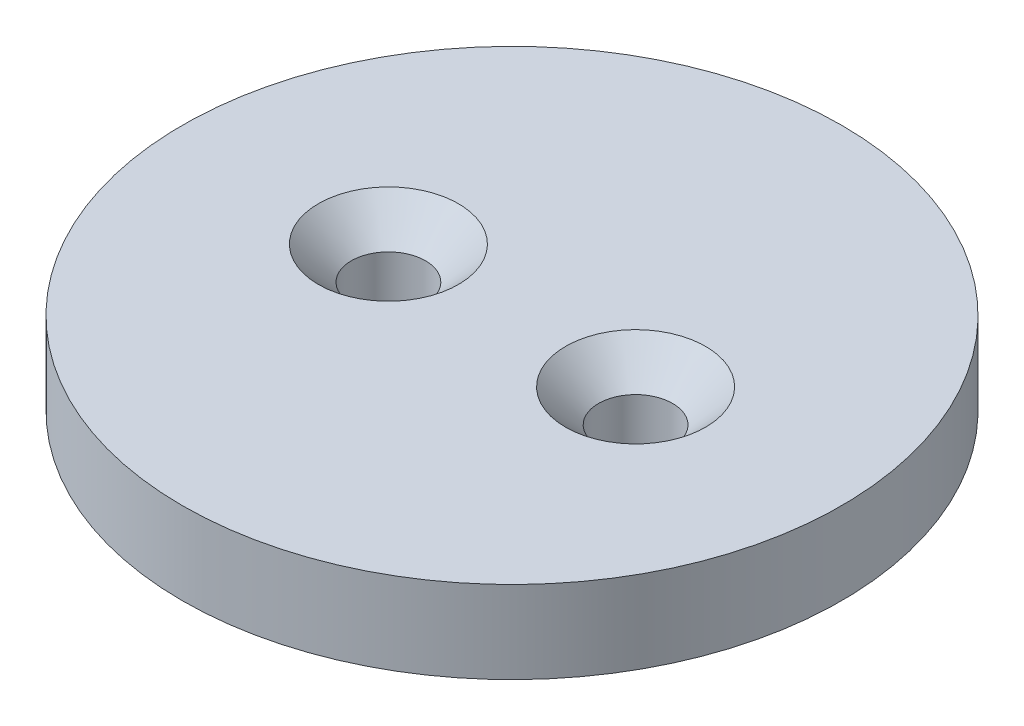
ISO-10303-21;
HEADER;
FILE_DESCRIPTION(('STEP AP214'),'2;1');
FILE_NAME('part.step','',(''),(''),'','','');
FILE_SCHEMA(('AUTOMOTIVE_DESIGN { 1 0 10303 214 1 1 1 1 }'));
ENDSEC;
DATA;
#1=APPLICATION_CONTEXT('core data for automotive mechanical design processes');
#2=APPLICATION_PROTOCOL_DEFINITION('international standard','automotive_design',2000,#1);
#3=PRODUCT_CONTEXT('',#1,'mechanical');
#4=PRODUCT('Part','Part','',(#3));
#5=PRODUCT_RELATED_PRODUCT_CATEGORY('part','',(#4));
#6=PRODUCT_DEFINITION_FORMATION('','',#4);
#7=PRODUCT_DEFINITION_CONTEXT('part definition',#1,'design');
#8=PRODUCT_DEFINITION('design','',#6,#7);
#9=PRODUCT_DEFINITION_SHAPE('','',#8);
#10=(LENGTH_UNIT() NAMED_UNIT(*) SI_UNIT(.MILLI.,.METRE.));
#11=(NAMED_UNIT(*) PLANE_ANGLE_UNIT() SI_UNIT($,.RADIAN.));
#12=(NAMED_UNIT(*) SI_UNIT($,.STERADIAN.) SOLID_ANGLE_UNIT());
#13=UNCERTAINTY_MEASURE_WITH_UNIT(LENGTH_MEASURE(1.E-05),#10,'distance_accuracy_value','');
#14=(GEOMETRIC_REPRESENTATION_CONTEXT(3) GLOBAL_UNCERTAINTY_ASSIGNED_CONTEXT((#13)) GLOBAL_UNIT_ASSIGNED_CONTEXT((#10,
#11,#12)) REPRESENTATION_CONTEXT('',''));
#15=CARTESIAN_POINT('',(0.,0.,0.));
#16=DIRECTION('',(0.,0.,1.));
#17=DIRECTION('',(1.,0.,0.));
#18=AXIS2_PLACEMENT_3D('',#15,#16,#17);
#19=CARTESIAN_POINT('',(0.,5.,0.));
#20=DIRECTION('',(0.,-1.,0.));
#21=DIRECTION('',(0.,0.,-1.));
#22=AXIS2_PLACEMENT_3D('',#19,#20,#21);
#23=CYLINDRICAL_SURFACE('',#22,20.);
#24=CARTESIAN_POINT('',(0.,5.,0.));
#25=DIRECTION('',(0.,1.,0.));
#26=DIRECTION('',(0.,0.,1.));
#27=AXIS2_PLACEMENT_3D('',#24,#25,#26);
#28=CIRCLE('',#27,20.);
#29=CARTESIAN_POINT('',(0.,5.,20.));
#30=VERTEX_POINT('',#29);
#31=EDGE_CURVE('E50',#30,#30,#28,.T.);
#32=ORIENTED_EDGE('',*,*,#31,.F.);
#33=EDGE_LOOP('',(#32));
#34=FACE_BOUND('',#33,.T.);
#35=CARTESIAN_POINT('',(0.,0.,0.));
#36=DIRECTION('',(0.,1.,0.));
#37=DIRECTION('',(0.,0.,1.));
#38=AXIS2_PLACEMENT_3D('',#35,#36,#37);
#39=CIRCLE('',#38,20.);
#40=CARTESIAN_POINT('',(0.,0.,20.));
#41=VERTEX_POINT('',#40);
#42=EDGE_CURVE('E51',#41,#41,#39,.T.);
#43=ORIENTED_EDGE('',*,*,#42,.T.);
#44=EDGE_LOOP('',(#43));
#45=FACE_BOUND('',#44,.T.);
#46=ADVANCED_FACE('F30',(#34,#45),#23,.T.);
#47=CARTESIAN_POINT('',(0.,5.,0.));
#48=DIRECTION('',(0.,1.,0.));
#49=DIRECTION('',(0.,0.,1.));
#50=AXIS2_PLACEMENT_3D('',#47,#48,#49);
#51=PLANE('',#50);
#52=CARTESIAN_POINT('',(7.5,5.,0.));
#53=DIRECTION('',(0.,1.,0.));
#54=DIRECTION('',(0.,0.,1.));
#55=AXIS2_PLACEMENT_3D('',#52,#53,#54);
#56=CIRCLE('',#55,4.25000000000002);
#57=CARTESIAN_POINT('',(7.5,5.,4.25000000000002));
#58=VERTEX_POINT('',#57);
#59=EDGE_CURVE('E37',#58,#58,#56,.F.);
#60=ORIENTED_EDGE('',*,*,#59,.T.);
#61=EDGE_LOOP('',(#60));
#62=FACE_BOUND('',#61,.T.);
#63=CARTESIAN_POINT('',(-7.5,5.,0.));
#64=DIRECTION('',(0.,1.,0.));
#65=DIRECTION('',(0.,0.,1.));
#66=AXIS2_PLACEMENT_3D('',#63,#64,#65);
#67=CIRCLE('',#66,4.25000000000002);
#68=CARTESIAN_POINT('',(-7.5,5.,4.25000000000002));
#69=VERTEX_POINT('',#68);
#70=EDGE_CURVE('E41',#69,#69,#67,.F.);
#71=ORIENTED_EDGE('',*,*,#70,.T.);
#72=EDGE_LOOP('',(#71));
#73=FACE_BOUND('',#72,.T.);
#74=ORIENTED_EDGE('',*,*,#31,.T.);
#75=EDGE_LOOP('',(#74));
#76=FACE_BOUND('',#75,.T.);
#77=ADVANCED_FACE('F79',(#62,#73,#76),#51,.T.);
#78=CARTESIAN_POINT('',(0.,0.,0.));
#79=DIRECTION('',(0.,1.,0.));
#80=DIRECTION('',(0.,0.,1.));
#81=AXIS2_PLACEMENT_3D('',#78,#79,#80);
#82=PLANE('',#81);
#83=CARTESIAN_POINT('',(7.5,0.,0.));
#84=DIRECTION('',(0.,1.,0.));
#85=DIRECTION('',(0.,0.,1.));
#86=AXIS2_PLACEMENT_3D('',#83,#84,#85);
#87=CIRCLE('',#86,2.25);
#88=CARTESIAN_POINT('',(7.5,0.,2.25));
#89=VERTEX_POINT('',#88);
#90=EDGE_CURVE('E59',#89,#89,#87,.T.);
#91=ORIENTED_EDGE('',*,*,#90,.T.);
#92=EDGE_LOOP('',(#91));
#93=FACE_BOUND('',#92,.T.);
#94=CARTESIAN_POINT('',(-7.5,0.,0.));
#95=DIRECTION('',(0.,1.,0.));
#96=DIRECTION('',(0.,0.,1.));
#97=AXIS2_PLACEMENT_3D('',#94,#95,#96);
#98=CIRCLE('',#97,2.25);
#99=CARTESIAN_POINT('',(-7.5,0.,2.25));
#100=VERTEX_POINT('',#99);
#101=EDGE_CURVE('E54',#100,#100,#98,.T.);
#102=ORIENTED_EDGE('',*,*,#101,.T.);
#103=EDGE_LOOP('',(#102));
#104=FACE_BOUND('',#103,.T.);
#105=ORIENTED_EDGE('',*,*,#42,.F.);
#106=EDGE_LOOP('',(#105));
#107=FACE_BOUND('',#106,.T.);
#108=ADVANCED_FACE('F63',(#93,#104,#107),#82,.F.);
#109=CARTESIAN_POINT('',(-7.5,0.,0.));
#110=DIRECTION('',(0.,1.,0.));
#111=DIRECTION('',(0.,0.,1.));
#112=AXIS2_PLACEMENT_3D('',#109,#110,#111);
#113=CYLINDRICAL_SURFACE('',#112,2.25);
#114=CARTESIAN_POINT('',(-7.5,2.99999999999999,0.));
#115=DIRECTION('',(0.,1.,0.));
#116=DIRECTION('',(0.,0.,1.));
#117=AXIS2_PLACEMENT_3D('',#114,#115,#116);
#118=CIRCLE('',#117,2.25);
#119=CARTESIAN_POINT('',(-7.5,2.99999999999999,2.25));
#120=VERTEX_POINT('',#119);
#121=EDGE_CURVE('E10',#120,#120,#118,.T.);
#122=ORIENTED_EDGE('',*,*,#121,.T.);
#123=EDGE_LOOP('',(#122));
#124=FACE_BOUND('',#123,.T.);
#125=ORIENTED_EDGE('',*,*,#101,.F.);
#126=EDGE_LOOP('',(#125));
#127=FACE_BOUND('',#126,.T.);
#128=ADVANCED_FACE('F69',(#124,#127),#113,.F.);
#129=CARTESIAN_POINT('',(7.5,0.,0.));
#130=DIRECTION('',(0.,1.,0.));
#131=DIRECTION('',(0.,0.,1.));
#132=AXIS2_PLACEMENT_3D('',#129,#130,#131);
#133=CYLINDRICAL_SURFACE('',#132,2.25);
#134=CARTESIAN_POINT('',(7.5,2.99999999999999,0.));
#135=DIRECTION('',(0.,1.,0.));
#136=DIRECTION('',(0.,0.,1.));
#137=AXIS2_PLACEMENT_3D('',#134,#135,#136);
#138=CIRCLE('',#137,2.25);
#139=CARTESIAN_POINT('',(7.5,2.99999999999999,2.25));
#140=VERTEX_POINT('',#139);
#141=EDGE_CURVE('E45',#140,#140,#138,.T.);
#142=ORIENTED_EDGE('',*,*,#141,.T.);
#143=EDGE_LOOP('',(#142));
#144=FACE_BOUND('',#143,.T.);
#145=ORIENTED_EDGE('',*,*,#90,.F.);
#146=EDGE_LOOP('',(#145));
#147=FACE_BOUND('',#146,.T.);
#148=ADVANCED_FACE('F66',(#144,#147),#133,.F.);
#149=CARTESIAN_POINT('',(7.5,2.99999999999999,0.));
#150=DIRECTION('',(0.,1.,0.));
#151=DIRECTION('',(0.,0.,1.));
#152=AXIS2_PLACEMENT_3D('',#149,#150,#151);
#153=CONICAL_SURFACE('',#152,2.25,0.78539816339745);
#154=ORIENTED_EDGE('',*,*,#59,.F.);
#155=EDGE_LOOP('',(#154));
#156=FACE_BOUND('',#155,.T.);
#157=ORIENTED_EDGE('',*,*,#141,.F.);
#158=EDGE_LOOP('',(#157));
#159=FACE_BOUND('',#158,.T.);
#160=ADVANCED_FACE('F68',(#156,#159),#153,.F.);
#161=CARTESIAN_POINT('',(-7.5,2.99999999999999,0.));
#162=DIRECTION('',(0.,1.,0.));
#163=DIRECTION('',(0.,0.,1.));
#164=AXIS2_PLACEMENT_3D('',#161,#162,#163);
#165=CONICAL_SURFACE('',#164,2.25,0.78539816339745);
#166=ORIENTED_EDGE('',*,*,#70,.F.);
#167=EDGE_LOOP('',(#166));
#168=FACE_BOUND('',#167,.T.);
#169=ORIENTED_EDGE('',*,*,#121,.F.);
#170=EDGE_LOOP('',(#169));
#171=FACE_BOUND('',#170,.T.);
#172=ADVANCED_FACE('F32',(#168,#171),#165,.F.);
#173=CLOSED_SHELL('',(#46,#77,#108,#128,#148,#160,#172));
#174=MANIFOLD_SOLID_BREP('B2',#173);
#175=ADVANCED_BREP_SHAPE_REPRESENTATION('',(#18,#174),#14);
#176=SHAPE_DEFINITION_REPRESENTATION(#9,#175);
ENDSEC;
END-ISO-10303-21;
